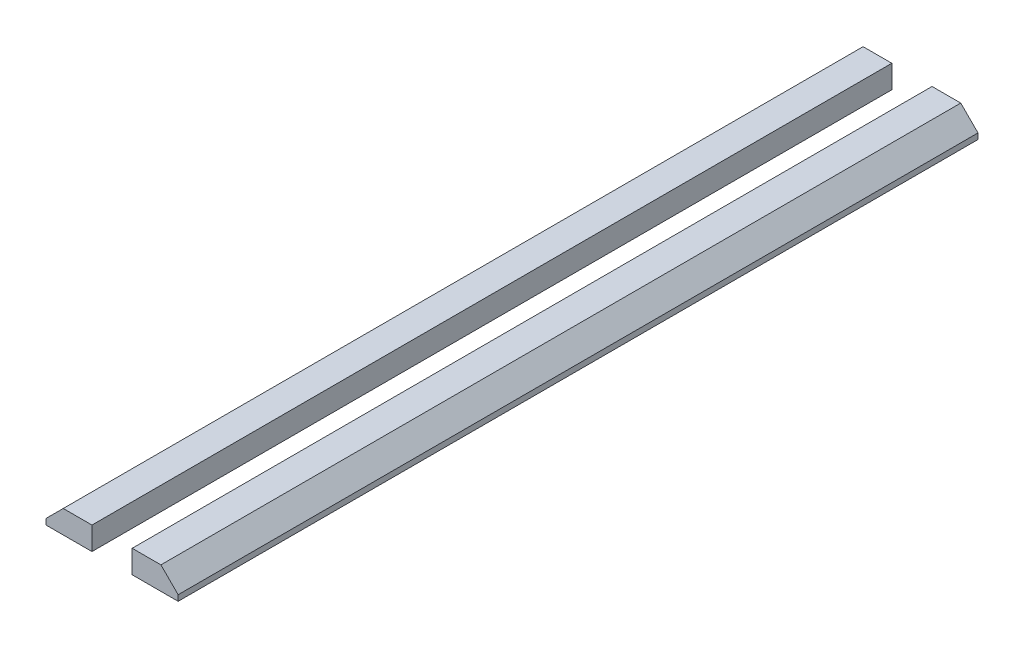
ISO-10303-21;
HEADER;
FILE_DESCRIPTION(('STEP AP214'),'2;1');
FILE_NAME('part.step','',(''),(''),'','','');
FILE_SCHEMA(('AUTOMOTIVE_DESIGN { 1 0 10303 214 1 1 1 1 }'));
ENDSEC;
DATA;
#1=APPLICATION_CONTEXT('core data for automotive mechanical design processes');
#2=APPLICATION_PROTOCOL_DEFINITION('international standard','automotive_design',2000,#1);
#3=PRODUCT_CONTEXT('',#1,'mechanical');
#4=PRODUCT('Part','Part','',(#3));
#5=PRODUCT_RELATED_PRODUCT_CATEGORY('part','',(#4));
#6=PRODUCT_DEFINITION_FORMATION('','',#4);
#7=PRODUCT_DEFINITION_CONTEXT('part definition',#1,'design');
#8=PRODUCT_DEFINITION('design','',#6,#7);
#9=PRODUCT_DEFINITION_SHAPE('','',#8);
#10=(LENGTH_UNIT() NAMED_UNIT(*) SI_UNIT(.MILLI.,.METRE.));
#11=(NAMED_UNIT(*) PLANE_ANGLE_UNIT() SI_UNIT($,.RADIAN.));
#12=(NAMED_UNIT(*) SI_UNIT($,.STERADIAN.) SOLID_ANGLE_UNIT());
#13=UNCERTAINTY_MEASURE_WITH_UNIT(LENGTH_MEASURE(1.E-05),#10,'distance_accuracy_value','');
#14=(GEOMETRIC_REPRESENTATION_CONTEXT(3) GLOBAL_UNCERTAINTY_ASSIGNED_CONTEXT((#13)) GLOBAL_UNIT_ASSIGNED_CONTEXT((#10,
#11,#12)) REPRESENTATION_CONTEXT('',''));
#15=CARTESIAN_POINT('',(0.,0.,0.));
#16=DIRECTION('',(0.,0.,1.));
#17=DIRECTION('',(1.,0.,0.));
#18=AXIS2_PLACEMENT_3D('',#15,#16,#17);
#19=CARTESIAN_POINT('',(0.,0.,0.));
#20=DIRECTION('',(0.,0.,1.));
#21=DIRECTION('',(1.,0.,0.));
#22=AXIS2_PLACEMENT_3D('',#19,#20,#21);
#23=PLANE('',#22);
#24=DIRECTION('',(0.707106781186547,-0.707106781186548,0.));
#25=VECTOR('',#24,1.);
#26=CARTESIAN_POINT('',(4.24999999999992,4.24999999999992,0.));
#27=LINE('',#26,#25);
#28=CARTESIAN_POINT('',(8.49999999999984,0.,0.));
#29=VERTEX_POINT('',#28);
#30=CARTESIAN_POINT('',(11.4999999999998,-3.,0.));
#31=VERTEX_POINT('',#30);
#32=EDGE_CURVE('E98',#29,#31,#27,.T.);
#33=ORIENTED_EDGE('',*,*,#32,.F.);
#34=DIRECTION('',(1.,0.,0.));
#35=VECTOR('',#34,1.);
#36=CARTESIAN_POINT('',(0.,0.,0.));
#37=LINE('',#36,#35);
#38=CARTESIAN_POINT('',(3.49999999999984,0.,0.));
#39=VERTEX_POINT('',#38);
#40=EDGE_CURVE('E105',#39,#29,#37,.T.);
#41=ORIENTED_EDGE('',*,*,#40,.F.);
#42=DIRECTION('',(0.,-1.,0.));
#43=VECTOR('',#42,1.);
#44=CARTESIAN_POINT('',(3.49999999999984,0.,0.));
#45=LINE('',#44,#43);
#46=CARTESIAN_POINT('',(3.49999999999984,-4.,0.));
#47=VERTEX_POINT('',#46);
#48=EDGE_CURVE('E111',#39,#47,#45,.T.);
#49=ORIENTED_EDGE('',*,*,#48,.T.);
#50=DIRECTION('',(1.,0.,0.));
#51=VECTOR('',#50,1.);
#52=CARTESIAN_POINT('',(0.,-4.,0.));
#53=LINE('',#52,#51);
#54=CARTESIAN_POINT('',(11.4999999999998,-4.,0.));
#55=VERTEX_POINT('',#54);
#56=EDGE_CURVE('E119',#47,#55,#53,.T.);
#57=ORIENTED_EDGE('',*,*,#56,.T.);
#58=DIRECTION('',(0.,1.,0.));
#59=VECTOR('',#58,1.);
#60=CARTESIAN_POINT('',(11.4999999999998,0.,0.));
#61=LINE('',#60,#59);
#62=EDGE_CURVE('E103',#55,#31,#61,.T.);
#63=ORIENTED_EDGE('',*,*,#62,.T.);
#64=EDGE_LOOP('',(#33,#41,#49,#57,#63));
#65=FACE_BOUND('',#64,.T.);
#66=ADVANCED_FACE('F47',(#65),#23,.T.);
#67=CARTESIAN_POINT('',(0.,0.,-148.161692696809));
#68=DIRECTION('',(0.,-1.,0.));
#69=DIRECTION('',(1.,0.,0.));
#70=AXIS2_PLACEMENT_3D('',#67,#68,#69);
#71=PLANE('',#70);
#72=DIRECTION('',(0.,0.,1.));
#73=VECTOR('',#72,1.);
#74=CARTESIAN_POINT('',(8.49999999999984,0.,-148.161692696809));
#75=LINE('',#74,#73);
#76=CARTESIAN_POINT('',(8.49999999999984,0.,-139.21742078681));
#77=VERTEX_POINT('',#76);
#78=EDGE_CURVE('E94',#77,#29,#75,.T.);
#79=ORIENTED_EDGE('',*,*,#78,.F.);
#80=DIRECTION('',(-1.,0.,0.));
#81=VECTOR('',#80,1.);
#82=CARTESIAN_POINT('',(0.,0.,-139.21742078681));
#83=LINE('',#82,#81);
#84=CARTESIAN_POINT('',(3.49999999999984,0.,-139.21742078681));
#85=VERTEX_POINT('',#84);
#86=EDGE_CURVE('E51',#77,#85,#83,.T.);
#87=ORIENTED_EDGE('',*,*,#86,.T.);
#88=DIRECTION('',(0.,0.,1.));
#89=VECTOR('',#88,1.);
#90=CARTESIAN_POINT('',(3.49999999999984,0.,-148.161692696809));
#91=LINE('',#90,#89);
#92=EDGE_CURVE('E102',#85,#39,#91,.T.);
#93=ORIENTED_EDGE('',*,*,#92,.T.);
#94=ORIENTED_EDGE('',*,*,#40,.T.);
#95=EDGE_LOOP('',(#79,#87,#93,#94));
#96=FACE_BOUND('',#95,.T.);
#97=ADVANCED_FACE('F106',(#96),#71,.F.);
#98=CARTESIAN_POINT('',(3.49999999999984,0.,-148.161692696809));
#99=DIRECTION('',(-1.,0.,0.));
#100=DIRECTION('',(0.,-1.,0.));
#101=AXIS2_PLACEMENT_3D('',#98,#99,#100);
#102=PLANE('',#101);
#103=DIRECTION('',(0.,1.,0.));
#104=VECTOR('',#103,1.);
#105=CARTESIAN_POINT('',(3.49999999999984,0.,-139.21742078681));
#106=LINE('',#105,#104);
#107=CARTESIAN_POINT('',(3.49999999999984,-4.,-139.21742078681));
#108=VERTEX_POINT('',#107);
#109=EDGE_CURVE('E132',#108,#85,#106,.T.);
#110=ORIENTED_EDGE('',*,*,#109,.F.);
#111=DIRECTION('',(0.,0.,1.));
#112=VECTOR('',#111,1.);
#113=CARTESIAN_POINT('',(3.49999999999984,-4.,-148.161692696809));
#114=LINE('',#113,#112);
#115=EDGE_CURVE('E126',#108,#47,#114,.T.);
#116=ORIENTED_EDGE('',*,*,#115,.T.);
#117=ORIENTED_EDGE('',*,*,#48,.F.);
#118=ORIENTED_EDGE('',*,*,#92,.F.);
#119=EDGE_LOOP('',(#110,#116,#117,#118));
#120=FACE_BOUND('',#119,.T.);
#121=ADVANCED_FACE('F131',(#120),#102,.T.);
#122=CARTESIAN_POINT('',(0.,-4.,-148.161692696809));
#123=DIRECTION('',(0.,-1.,0.));
#124=DIRECTION('',(1.,0.,0.));
#125=AXIS2_PLACEMENT_3D('',#122,#123,#124);
#126=PLANE('',#125);
#127=DIRECTION('',(-1.,0.,0.));
#128=VECTOR('',#127,1.);
#129=CARTESIAN_POINT('',(0.,-4.,-139.21742078681));
#130=LINE('',#129,#128);
#131=CARTESIAN_POINT('',(11.4999999999998,-4.,-139.21742078681));
#132=VERTEX_POINT('',#131);
#133=EDGE_CURVE('E68',#132,#108,#130,.T.);
#134=ORIENTED_EDGE('',*,*,#133,.F.);
#135=DIRECTION('',(0.,0.,1.));
#136=VECTOR('',#135,1.);
#137=CARTESIAN_POINT('',(11.4999999999998,-4.,-148.161692696809));
#138=LINE('',#137,#136);
#139=EDGE_CURVE('E124',#132,#55,#138,.T.);
#140=ORIENTED_EDGE('',*,*,#139,.T.);
#141=ORIENTED_EDGE('',*,*,#56,.F.);
#142=ORIENTED_EDGE('',*,*,#115,.F.);
#143=EDGE_LOOP('',(#134,#140,#141,#142));
#144=FACE_BOUND('',#143,.T.);
#145=ADVANCED_FACE('F134',(#144),#126,.T.);
#146=CARTESIAN_POINT('',(11.4999999999998,0.,-148.161692696809));
#147=DIRECTION('',(1.,0.,0.));
#148=DIRECTION('',(0.,0.,-1.));
#149=AXIS2_PLACEMENT_3D('',#146,#147,#148);
#150=PLANE('',#149);
#151=DIRECTION('',(0.,-1.,0.));
#152=VECTOR('',#151,1.);
#153=CARTESIAN_POINT('',(11.4999999999998,0.,-139.21742078681));
#154=LINE('',#153,#152);
#155=CARTESIAN_POINT('',(11.4999999999998,-3.,-139.21742078681));
#156=VERTEX_POINT('',#155);
#157=EDGE_CURVE('E56',#156,#132,#154,.T.);
#158=ORIENTED_EDGE('',*,*,#157,.F.);
#159=DIRECTION('',(0.,0.,1.));
#160=VECTOR('',#159,1.);
#161=CARTESIAN_POINT('',(11.4999999999998,-3.,-148.161692696809));
#162=LINE('',#161,#160);
#163=EDGE_CURVE('E122',#156,#31,#162,.T.);
#164=ORIENTED_EDGE('',*,*,#163,.T.);
#165=ORIENTED_EDGE('',*,*,#62,.F.);
#166=ORIENTED_EDGE('',*,*,#139,.F.);
#167=EDGE_LOOP('',(#158,#164,#165,#166));
#168=FACE_BOUND('',#167,.T.);
#169=ADVANCED_FACE('F136',(#168),#150,.T.);
#170=CARTESIAN_POINT('',(4.24999999999992,4.24999999999992,-148.161692696809));
#171=DIRECTION('',(-0.707106781186548,-0.707106781186547,0.));
#172=DIRECTION('',(0.707106781186547,-0.707106781186548,0.));
#173=AXIS2_PLACEMENT_3D('',#170,#171,#172);
#174=PLANE('',#173);
#175=ORIENTED_EDGE('',*,*,#163,.F.);
#176=DIRECTION('',(-0.707106781186547,0.707106781186548,0.));
#177=VECTOR('',#176,1.);
#178=CARTESIAN_POINT('',(4.24999999999992,4.24999999999992,-139.21742078681));
#179=LINE('',#178,#177);
#180=EDGE_CURVE('E12',#156,#77,#179,.T.);
#181=ORIENTED_EDGE('',*,*,#180,.T.);
#182=ORIENTED_EDGE('',*,*,#78,.T.);
#183=ORIENTED_EDGE('',*,*,#32,.T.);
#184=EDGE_LOOP('',(#175,#181,#182,#183));
#185=FACE_BOUND('',#184,.T.);
#186=ADVANCED_FACE('F49',(#185),#174,.F.);
#187=CARTESIAN_POINT('',(-3.39797634474337E-10,-4.99999999999723,-139.21742078681));
#188=DIRECTION('',(0.,0.,1.));
#189=DIRECTION('',(1.,0.,0.));
#190=AXIS2_PLACEMENT_3D('',#187,#188,#189);
#191=PLANE('',#190);
#192=ORIENTED_EDGE('',*,*,#157,.T.);
#193=ORIENTED_EDGE('',*,*,#133,.T.);
#194=ORIENTED_EDGE('',*,*,#109,.T.);
#195=ORIENTED_EDGE('',*,*,#86,.F.);
#196=ORIENTED_EDGE('',*,*,#180,.F.);
#197=EDGE_LOOP('',(#192,#193,#194,#195,#196));
#198=FACE_BOUND('',#197,.T.);
#199=ADVANCED_FACE('F139',(#198),#191,.F.);
#200=CLOSED_SHELL('',(#66,#97,#121,#145,#169,#186,#199));
#201=MANIFOLD_SOLID_BREP('B2',#200);
#202=CARTESIAN_POINT('',(0.,0.,-148.161692696809));
#203=DIRECTION('',(0.,1.,0.));
#204=DIRECTION('',(-1.,0.,0.));
#205=AXIS2_PLACEMENT_3D('',#202,#203,#204);
#206=PLANE('',#205);
#207=DIRECTION('',(1.,0.,0.));
#208=VECTOR('',#207,1.);
#209=CARTESIAN_POINT('',(0.,0.,-139.21742078681));
#210=LINE('',#209,#208);
#211=CARTESIAN_POINT('',(-8.49999999999984,0.,-139.21742078681));
#212=VERTEX_POINT('',#211);
#213=CARTESIAN_POINT('',(-3.49999999999984,0.,-139.21742078681));
#214=VERTEX_POINT('',#213);
#215=EDGE_CURVE('E204',#212,#214,#210,.T.);
#216=ORIENTED_EDGE('',*,*,#215,.F.);
#217=DIRECTION('',(0.,0.,1.));
#218=VECTOR('',#217,1.);
#219=CARTESIAN_POINT('',(-8.49999999999984,0.,-148.161692696809));
#220=LINE('',#219,#218);
#221=CARTESIAN_POINT('',(-8.49999999999984,0.,0.));
#222=VERTEX_POINT('',#221);
#223=EDGE_CURVE('E241',#212,#222,#220,.T.);
#224=ORIENTED_EDGE('',*,*,#223,.T.);
#225=DIRECTION('',(-1.,0.,0.));
#226=VECTOR('',#225,1.);
#227=CARTESIAN_POINT('',(0.,0.,0.));
#228=LINE('',#227,#226);
#229=CARTESIAN_POINT('',(-3.49999999999984,0.,0.));
#230=VERTEX_POINT('',#229);
#231=EDGE_CURVE('E245',#230,#222,#228,.T.);
#232=ORIENTED_EDGE('',*,*,#231,.F.);
#233=DIRECTION('',(0.,0.,1.));
#234=VECTOR('',#233,1.);
#235=CARTESIAN_POINT('',(-3.49999999999984,0.,-148.161692696809));
#236=LINE('',#235,#234);
#237=EDGE_CURVE('E272',#214,#230,#236,.T.);
#238=ORIENTED_EDGE('',*,*,#237,.F.);
#239=EDGE_LOOP('',(#216,#224,#232,#238));
#240=FACE_BOUND('',#239,.T.);
#241=ADVANCED_FACE('F197',(#240),#206,.T.);
#242=CARTESIAN_POINT('',(-3.49999999999984,0.,-148.161692696809));
#243=DIRECTION('',(-1.,0.,0.));
#244=DIRECTION('',(0.,-1.,0.));
#245=AXIS2_PLACEMENT_3D('',#242,#243,#244);
#246=PLANE('',#245);
#247=DIRECTION('',(0.,0.,1.));
#248=VECTOR('',#247,1.);
#249=CARTESIAN_POINT('',(-3.49999999999984,-4.,-148.161692696809));
#250=LINE('',#249,#248);
#251=CARTESIAN_POINT('',(-3.49999999999984,-4.,-139.21742078681));
#252=VERTEX_POINT('',#251);
#253=CARTESIAN_POINT('',(-3.49999999999984,-4.,0.));
#254=VERTEX_POINT('',#253);
#255=EDGE_CURVE('E275',#252,#254,#250,.T.);
#256=ORIENTED_EDGE('',*,*,#255,.F.);
#257=DIRECTION('',(0.,1.,0.));
#258=VECTOR('',#257,1.);
#259=CARTESIAN_POINT('',(-3.49999999999984,0.,-139.21742078681));
#260=LINE('',#259,#258);
#261=EDGE_CURVE('E216',#252,#214,#260,.T.);
#262=ORIENTED_EDGE('',*,*,#261,.T.);
#263=ORIENTED_EDGE('',*,*,#237,.T.);
#264=DIRECTION('',(0.,-1.,0.));
#265=VECTOR('',#264,1.);
#266=CARTESIAN_POINT('',(-3.49999999999984,0.,0.));
#267=LINE('',#266,#265);
#268=EDGE_CURVE('E249',#230,#254,#267,.T.);
#269=ORIENTED_EDGE('',*,*,#268,.T.);
#270=EDGE_LOOP('',(#256,#262,#263,#269));
#271=FACE_BOUND('',#270,.T.);
#272=ADVANCED_FACE('F286',(#271),#246,.F.);
#273=CARTESIAN_POINT('',(0.,-4.,-148.161692696809));
#274=DIRECTION('',(0.,1.,0.));
#275=DIRECTION('',(-1.,0.,0.));
#276=AXIS2_PLACEMENT_3D('',#273,#274,#275);
#277=PLANE('',#276);
#278=DIRECTION('',(0.,0.,1.));
#279=VECTOR('',#278,1.);
#280=CARTESIAN_POINT('',(-11.4999999999998,-4.,-148.161692696809));
#281=LINE('',#280,#279);
#282=CARTESIAN_POINT('',(-11.4999999999998,-4.,-139.21742078681));
#283=VERTEX_POINT('',#282);
#284=CARTESIAN_POINT('',(-11.4999999999998,-4.,0.));
#285=VERTEX_POINT('',#284);
#286=EDGE_CURVE('E277',#283,#285,#281,.T.);
#287=ORIENTED_EDGE('',*,*,#286,.F.);
#288=DIRECTION('',(1.,0.,0.));
#289=VECTOR('',#288,1.);
#290=CARTESIAN_POINT('',(0.,-4.,-139.21742078681));
#291=LINE('',#290,#289);
#292=EDGE_CURVE('E211',#283,#252,#291,.T.);
#293=ORIENTED_EDGE('',*,*,#292,.T.);
#294=ORIENTED_EDGE('',*,*,#255,.T.);
#295=DIRECTION('',(-1.,0.,0.));
#296=VECTOR('',#295,1.);
#297=CARTESIAN_POINT('',(0.,-4.,0.));
#298=LINE('',#297,#296);
#299=EDGE_CURVE('E268',#254,#285,#298,.T.);
#300=ORIENTED_EDGE('',*,*,#299,.T.);
#301=EDGE_LOOP('',(#287,#293,#294,#300));
#302=FACE_BOUND('',#301,.T.);
#303=ADVANCED_FACE('F283',(#302),#277,.F.);
#304=CARTESIAN_POINT('',(-11.4999999999998,0.,-148.161692696809));
#305=DIRECTION('',(1.,0.,0.));
#306=DIRECTION('',(0.,0.,-1.));
#307=AXIS2_PLACEMENT_3D('',#304,#305,#306);
#308=PLANE('',#307);
#309=DIRECTION('',(0.,0.,1.));
#310=VECTOR('',#309,1.);
#311=CARTESIAN_POINT('',(-11.4999999999998,-3.,-148.161692696809));
#312=LINE('',#311,#310);
#313=CARTESIAN_POINT('',(-11.4999999999998,-3.,-139.21742078681));
#314=VERTEX_POINT('',#313);
#315=CARTESIAN_POINT('',(-11.4999999999998,-3.,0.));
#316=VERTEX_POINT('',#315);
#317=EDGE_CURVE('E248',#314,#316,#312,.T.);
#318=ORIENTED_EDGE('',*,*,#317,.F.);
#319=DIRECTION('',(0.,-1.,0.));
#320=VECTOR('',#319,1.);
#321=CARTESIAN_POINT('',(-11.4999999999998,0.,-139.21742078681));
#322=LINE('',#321,#320);
#323=EDGE_CURVE('E274',#314,#283,#322,.T.);
#324=ORIENTED_EDGE('',*,*,#323,.T.);
#325=ORIENTED_EDGE('',*,*,#286,.T.);
#326=DIRECTION('',(0.,1.,0.));
#327=VECTOR('',#326,1.);
#328=CARTESIAN_POINT('',(-11.4999999999998,0.,0.));
#329=LINE('',#328,#327);
#330=EDGE_CURVE('E257',#285,#316,#329,.T.);
#331=ORIENTED_EDGE('',*,*,#330,.T.);
#332=EDGE_LOOP('',(#318,#324,#325,#331));
#333=FACE_BOUND('',#332,.T.);
#334=ADVANCED_FACE('F281',(#333),#308,.F.);
#335=CARTESIAN_POINT('',(-4.24999999999992,4.24999999999992,-148.161692696809));
#336=DIRECTION('',(-0.707106781186548,0.707106781186547,0.));
#337=DIRECTION('',(-0.707106781186547,-0.707106781186548,0.));
#338=AXIS2_PLACEMENT_3D('',#335,#336,#337);
#339=PLANE('',#338);
#340=DIRECTION('',(0.707106781186547,0.707106781186548,0.));
#341=VECTOR('',#340,1.);
#342=CARTESIAN_POINT('',(-4.24999999999992,4.24999999999992,-139.21742078681));
#343=LINE('',#342,#341);
#344=EDGE_CURVE('E45',#314,#212,#343,.T.);
#345=ORIENTED_EDGE('',*,*,#344,.F.);
#346=ORIENTED_EDGE('',*,*,#317,.T.);
#347=DIRECTION('',(-0.707106781186547,-0.707106781186548,0.));
#348=VECTOR('',#347,1.);
#349=CARTESIAN_POINT('',(-4.24999999999992,4.24999999999992,0.));
#350=LINE('',#349,#348);
#351=EDGE_CURVE('E251',#222,#316,#350,.T.);
#352=ORIENTED_EDGE('',*,*,#351,.F.);
#353=ORIENTED_EDGE('',*,*,#223,.F.);
#354=EDGE_LOOP('',(#345,#346,#352,#353));
#355=FACE_BOUND('',#354,.T.);
#356=ADVANCED_FACE('F252',(#355),#339,.T.);
#357=CARTESIAN_POINT('',(0.,0.,0.));
#358=DIRECTION('',(0.,0.,1.));
#359=DIRECTION('',(1.,0.,0.));
#360=AXIS2_PLACEMENT_3D('',#357,#358,#359);
#361=PLANE('',#360);
#362=ORIENTED_EDGE('',*,*,#231,.T.);
#363=ORIENTED_EDGE('',*,*,#351,.T.);
#364=ORIENTED_EDGE('',*,*,#330,.F.);
#365=ORIENTED_EDGE('',*,*,#299,.F.);
#366=ORIENTED_EDGE('',*,*,#268,.F.);
#367=EDGE_LOOP('',(#362,#363,#364,#365,#366));
#368=FACE_BOUND('',#367,.T.);
#369=ADVANCED_FACE('F260',(#368),#361,.T.);
#370=CARTESIAN_POINT('',(-3.39797634474337E-10,-4.99999999999723,-139.21742078681));
#371=DIRECTION('',(0.,0.,1.));
#372=DIRECTION('',(1.,0.,0.));
#373=AXIS2_PLACEMENT_3D('',#370,#371,#372);
#374=PLANE('',#373);
#375=ORIENTED_EDGE('',*,*,#215,.T.);
#376=ORIENTED_EDGE('',*,*,#261,.F.);
#377=ORIENTED_EDGE('',*,*,#292,.F.);
#378=ORIENTED_EDGE('',*,*,#323,.F.);
#379=ORIENTED_EDGE('',*,*,#344,.T.);
#380=EDGE_LOOP('',(#375,#376,#377,#378,#379));
#381=FACE_BOUND('',#380,.T.);
#382=ADVANCED_FACE('F289',(#381),#374,.F.);
#383=CLOSED_SHELL('',(#241,#272,#303,#334,#356,#369,#382));
#384=MANIFOLD_SOLID_BREP('B6',#383);
#385=ADVANCED_BREP_SHAPE_REPRESENTATION('',(#18,#201,#384),#14);
#386=SHAPE_DEFINITION_REPRESENTATION(#9,#385);
ENDSEC;
END-ISO-10303-21;
